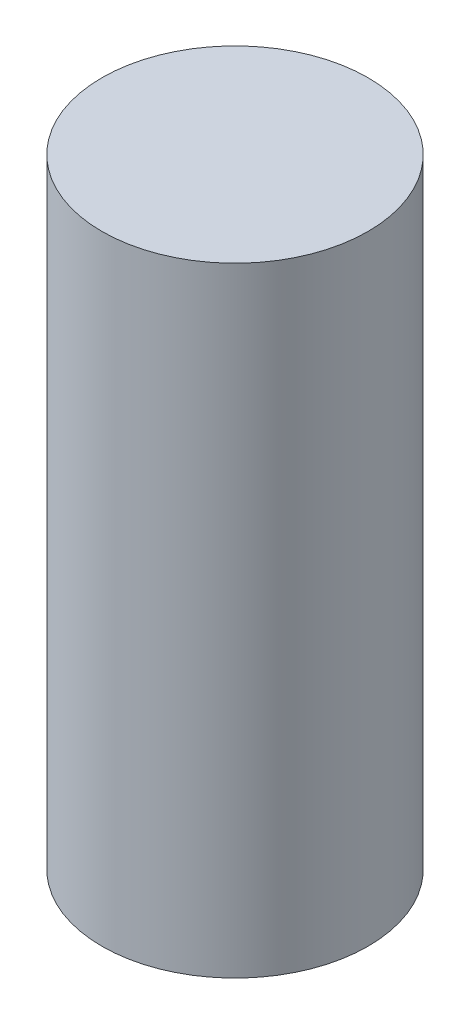
ISO-10303-21;
HEADER;
FILE_DESCRIPTION(('STEP AP214'),'2;1');
FILE_NAME('part.step','',(''),(''),'','','');
FILE_SCHEMA(('AUTOMOTIVE_DESIGN { 1 0 10303 214 1 1 1 1 }'));
ENDSEC;
DATA;
#1=APPLICATION_CONTEXT('core data for automotive mechanical design processes');
#2=APPLICATION_PROTOCOL_DEFINITION('international standard','automotive_design',2000,#1);
#3=PRODUCT_CONTEXT('',#1,'mechanical');
#4=PRODUCT('Part','Part','',(#3));
#5=PRODUCT_RELATED_PRODUCT_CATEGORY('part','',(#4));
#6=PRODUCT_DEFINITION_FORMATION('','',#4);
#7=PRODUCT_DEFINITION_CONTEXT('part definition',#1,'design');
#8=PRODUCT_DEFINITION('design','',#6,#7);
#9=PRODUCT_DEFINITION_SHAPE('','',#8);
#10=(LENGTH_UNIT() NAMED_UNIT(*) SI_UNIT(.MILLI.,.METRE.));
#11=(NAMED_UNIT(*) PLANE_ANGLE_UNIT() SI_UNIT($,.RADIAN.));
#12=(NAMED_UNIT(*) SI_UNIT($,.STERADIAN.) SOLID_ANGLE_UNIT());
#13=UNCERTAINTY_MEASURE_WITH_UNIT(LENGTH_MEASURE(1.E-05),#10,'distance_accuracy_value','');
#14=(GEOMETRIC_REPRESENTATION_CONTEXT(3) GLOBAL_UNCERTAINTY_ASSIGNED_CONTEXT((#13)) GLOBAL_UNIT_ASSIGNED_CONTEXT((#10,
#11,#12)) REPRESENTATION_CONTEXT('',''));
#15=CARTESIAN_POINT('',(0.,0.,0.));
#16=DIRECTION('',(0.,0.,1.));
#17=DIRECTION('',(1.,0.,0.));
#18=AXIS2_PLACEMENT_3D('',#15,#16,#17);
#19=CARTESIAN_POINT('',(0.,100.,0.));
#20=DIRECTION('',(0.,-1.,0.));
#21=DIRECTION('',(0.,0.,-1.));
#22=AXIS2_PLACEMENT_3D('',#19,#20,#21);
#23=CYLINDRICAL_SURFACE('',#22,21.5);
#24=CARTESIAN_POINT('',(0.,100.,0.));
#25=DIRECTION('',(0.,1.,0.));
#26=DIRECTION('',(0.,0.,1.));
#27=AXIS2_PLACEMENT_3D('',#24,#25,#26);
#28=CIRCLE('',#27,21.5);
#29=CARTESIAN_POINT('',(0.,100.,21.5));
#30=VERTEX_POINT('',#29);
#31=EDGE_CURVE('E10',#30,#30,#28,.T.);
#32=ORIENTED_EDGE('',*,*,#31,.F.);
#33=EDGE_LOOP('',(#32));
#34=FACE_BOUND('',#33,.T.);
#35=CARTESIAN_POINT('',(0.,0.,0.));
#36=DIRECTION('',(0.,1.,0.));
#37=DIRECTION('',(0.,0.,1.));
#38=AXIS2_PLACEMENT_3D('',#35,#36,#37);
#39=CIRCLE('',#38,21.5);
#40=CARTESIAN_POINT('',(0.,0.,21.5));
#41=VERTEX_POINT('',#40);
#42=EDGE_CURVE('E40',#41,#41,#39,.T.);
#43=ORIENTED_EDGE('',*,*,#42,.T.);
#44=EDGE_LOOP('',(#43));
#45=FACE_BOUND('',#44,.T.);
#46=ADVANCED_FACE('F37',(#34,#45),#23,.T.);
#47=CARTESIAN_POINT('',(0.,100.,0.));
#48=DIRECTION('',(0.,1.,0.));
#49=DIRECTION('',(0.,0.,1.));
#50=AXIS2_PLACEMENT_3D('',#47,#48,#49);
#51=PLANE('',#50);
#52=ORIENTED_EDGE('',*,*,#31,.T.);
#53=EDGE_LOOP('',(#52));
#54=FACE_BOUND('',#53,.T.);
#55=ADVANCED_FACE('F52',(#54),#51,.T.);
#56=CARTESIAN_POINT('',(0.,0.,0.));
#57=DIRECTION('',(0.,1.,0.));
#58=DIRECTION('',(0.,0.,1.));
#59=AXIS2_PLACEMENT_3D('',#56,#57,#58);
#60=PLANE('',#59);
#61=ORIENTED_EDGE('',*,*,#42,.F.);
#62=EDGE_LOOP('',(#61));
#63=FACE_BOUND('',#62,.T.);
#64=ADVANCED_FACE('F50',(#63),#60,.F.);
#65=CLOSED_SHELL('',(#46,#55,#64));
#66=MANIFOLD_SOLID_BREP('B2',#65);
#67=ADVANCED_BREP_SHAPE_REPRESENTATION('',(#18,#66),#14);
#68=SHAPE_DEFINITION_REPRESENTATION(#9,#67);
ENDSEC;
END-ISO-10303-21;
